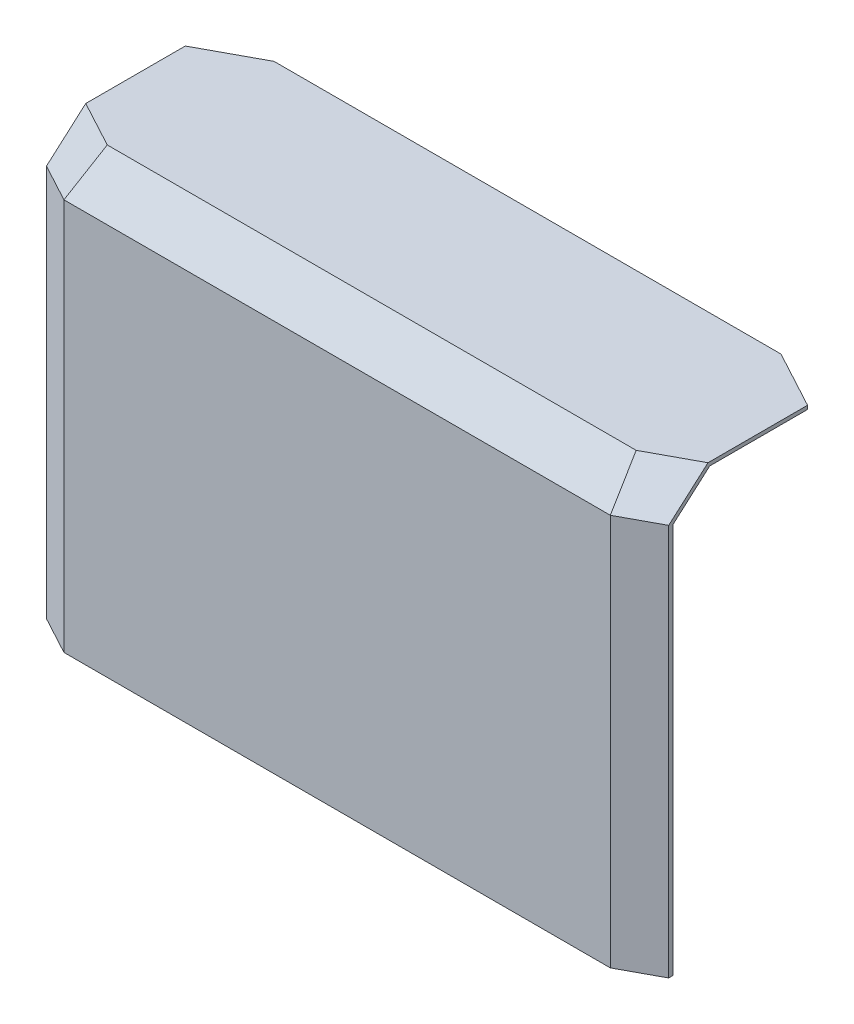
ISO-10303-21;
HEADER;
FILE_DESCRIPTION(('STEP AP214'),'2;1');
FILE_NAME('part.step','',(''),(''),'','','');
FILE_SCHEMA(('AUTOMOTIVE_DESIGN { 1 0 10303 214 1 1 1 1 }'));
ENDSEC;
DATA;
#1=APPLICATION_CONTEXT('core data for automotive mechanical design processes');
#2=APPLICATION_PROTOCOL_DEFINITION('international standard','automotive_design',2000,#1);
#3=PRODUCT_CONTEXT('',#1,'mechanical');
#4=PRODUCT('Part','Part','',(#3));
#5=PRODUCT_RELATED_PRODUCT_CATEGORY('part','',(#4));
#6=PRODUCT_DEFINITION_FORMATION('','',#4);
#7=PRODUCT_DEFINITION_CONTEXT('part definition',#1,'design');
#8=PRODUCT_DEFINITION('design','',#6,#7);
#9=PRODUCT_DEFINITION_SHAPE('','',#8);
#10=(LENGTH_UNIT() NAMED_UNIT(*) SI_UNIT(.MILLI.,.METRE.));
#11=(NAMED_UNIT(*) PLANE_ANGLE_UNIT() SI_UNIT($,.RADIAN.));
#12=(NAMED_UNIT(*) SI_UNIT($,.STERADIAN.) SOLID_ANGLE_UNIT());
#13=UNCERTAINTY_MEASURE_WITH_UNIT(LENGTH_MEASURE(1.E-05),#10,'distance_accuracy_value','');
#14=(GEOMETRIC_REPRESENTATION_CONTEXT(3) GLOBAL_UNCERTAINTY_ASSIGNED_CONTEXT((#13)) GLOBAL_UNIT_ASSIGNED_CONTEXT((#10,
#11,#12)) REPRESENTATION_CONTEXT('',''));
#15=CARTESIAN_POINT('',(0.,0.,0.));
#16=DIRECTION('',(0.,0.,1.));
#17=DIRECTION('',(1.,0.,0.));
#18=AXIS2_PLACEMENT_3D('',#15,#16,#17);
#19=CARTESIAN_POINT('',(354.056220457634,49.99,163.381713280479));
#20=DIRECTION('',(-1.,0.,0.));
#21=DIRECTION('',(0.,0.,1.));
#22=AXIS2_PLACEMENT_3D('',#19,#20,#21);
#23=PLANE('',#22);
#24=DIRECTION('',(0.,-0.660751107356154,0.750605072010319));
#25=VECTOR('',#24,1.);
#26=CARTESIAN_POINT('',(354.056220457634,374.541367845536,301.368842451599));
#27=LINE('',#26,#25);
#28=CARTESIAN_POINT('',(354.056220457634,420.,249.728399504298));
#29=VERTEX_POINT('',#28);
#30=CARTESIAN_POINT('',(354.056220457634,390.,283.808027838802));
#31=VERTEX_POINT('',#30);
#32=EDGE_CURVE('E266',#29,#31,#27,.T.);
#33=ORIENTED_EDGE('',*,*,#32,.T.);
#34=DIRECTION('',(0.,1.,0.));
#35=VECTOR('',#34,1.);
#36=CARTESIAN_POINT('',(354.056220457634,1040.95052293774,283.808027838802));
#37=LINE('',#36,#35);
#38=CARTESIAN_POINT('',(354.056220457634,50.,283.808027838802));
#39=VERTEX_POINT('',#38);
#40=EDGE_CURVE('E270',#39,#31,#37,.T.);
#41=ORIENTED_EDGE('',*,*,#40,.F.);
#42=DIRECTION('',(0.,0.,1.));
#43=VECTOR('',#42,1.);
#44=CARTESIAN_POINT('',(354.056220457634,50.,20.9300000000832));
#45=LINE('',#44,#43);
#46=CARTESIAN_POINT('',(354.056220457634,50.,280.195587235344));
#47=VERTEX_POINT('',#46);
#48=EDGE_CURVE('E268',#47,#39,#45,.T.);
#49=ORIENTED_EDGE('',*,*,#48,.F.);
#50=DIRECTION('',(0.,1.,0.));
#51=VECTOR('',#50,1.);
#52=CARTESIAN_POINT('',(354.056220457634,1040.95052293774,280.195587235344));
#53=LINE('',#52,#51);
#54=CARTESIAN_POINT('',(354.056220457634,388.682800871653,280.195587235344));
#55=VERTEX_POINT('',#54);
#56=EDGE_CURVE('E58',#47,#55,#53,.T.);
#57=ORIENTED_EDGE('',*,*,#56,.T.);
#58=DIRECTION('',(0.,-0.660751107356154,0.750605072010319));
#59=VECTOR('',#58,1.);
#60=CARTESIAN_POINT('',(354.056220457634,372.007609995386,299.138397484348));
#61=LINE('',#60,#59);
#62=CARTESIAN_POINT('',(354.056220457634,416.82,248.232077613078));
#63=VERTEX_POINT('',#62);
#64=EDGE_CURVE('E218',#63,#55,#61,.T.);
#65=ORIENTED_EDGE('',*,*,#64,.F.);
#66=DIRECTION('',(0.,0.,1.));
#67=VECTOR('',#66,1.);
#68=CARTESIAN_POINT('',(354.056220457634,416.82,0.));
#69=LINE('',#68,#67);
#70=CARTESIAN_POINT('',(354.056220457634,416.82,163.381713280479));
#71=VERTEX_POINT('',#70);
#72=EDGE_CURVE('E172',#71,#63,#69,.T.);
#73=ORIENTED_EDGE('',*,*,#72,.F.);
#74=DIRECTION('',(0.,1.,0.));
#75=VECTOR('',#74,1.);
#76=CARTESIAN_POINT('',(354.056220457634,49.99,163.381713280479));
#77=LINE('',#76,#75);
#78=CARTESIAN_POINT('',(354.056220457634,420.,163.381713280479));
#79=VERTEX_POINT('',#78);
#80=EDGE_CURVE('E11',#71,#79,#77,.T.);
#81=ORIENTED_EDGE('',*,*,#80,.T.);
#82=DIRECTION('',(0.,0.,1.));
#83=VECTOR('',#82,1.);
#84=CARTESIAN_POINT('',(354.056220457634,420.,0.));
#85=LINE('',#84,#83);
#86=EDGE_CURVE('E243',#79,#29,#85,.T.);
#87=ORIENTED_EDGE('',*,*,#86,.T.);
#88=EDGE_LOOP('',(#33,#41,#49,#57,#65,#73,#81,#87));
#89=FACE_BOUND('',#88,.T.);
#90=ADVANCED_FACE('F33',(#89),#23,.F.);
#91=CARTESIAN_POINT('',(-185.65,49.99,313.732193207324));
#92=DIRECTION('',(1.,0.,0.));
#93=DIRECTION('',(0.,0.,-1.));
#94=AXIS2_PLACEMENT_3D('',#91,#92,#93);
#95=PLANE('',#94);
#96=DIRECTION('',(0.,0.660751107356154,-0.750605072010319));
#97=VECTOR('',#96,1.);
#98=CARTESIAN_POINT('',(-185.65,409.424009809615,261.742593336221));
#99=LINE('',#98,#97);
#100=CARTESIAN_POINT('',(-185.65,390.,283.808027838802));
#101=VERTEX_POINT('',#100);
#102=CARTESIAN_POINT('',(-185.65,420.,249.728399504298));
#103=VERTEX_POINT('',#102);
#104=EDGE_CURVE('E37',#101,#103,#99,.T.);
#105=ORIENTED_EDGE('',*,*,#104,.T.);
#106=DIRECTION('',(0.,0.,-1.));
#107=VECTOR('',#106,1.);
#108=CARTESIAN_POINT('',(-185.65,420.,0.));
#109=LINE('',#108,#107);
#110=CARTESIAN_POINT('',(-185.65,420.,163.381713280479));
#111=VERTEX_POINT('',#110);
#112=EDGE_CURVE('E254',#103,#111,#109,.T.);
#113=ORIENTED_EDGE('',*,*,#112,.T.);
#114=DIRECTION('',(0.,1.,0.));
#115=VECTOR('',#114,1.);
#116=CARTESIAN_POINT('',(-185.65,49.99,163.381713280479));
#117=LINE('',#116,#115);
#118=CARTESIAN_POINT('',(-185.65,416.82,163.381713280479));
#119=VERTEX_POINT('',#118);
#120=EDGE_CURVE('E261',#119,#111,#117,.T.);
#121=ORIENTED_EDGE('',*,*,#120,.F.);
#122=DIRECTION('',(0.,0.,-1.));
#123=VECTOR('',#122,1.);
#124=CARTESIAN_POINT('',(-185.65,416.82,0.));
#125=LINE('',#124,#123);
#126=CARTESIAN_POINT('',(-185.65,416.82,248.232077613078));
#127=VERTEX_POINT('',#126);
#128=EDGE_CURVE('E242',#127,#119,#125,.T.);
#129=ORIENTED_EDGE('',*,*,#128,.F.);
#130=DIRECTION('',(0.,0.660751107356154,-0.750605072010319));
#131=VECTOR('',#130,1.);
#132=CARTESIAN_POINT('',(-185.65,406.890251959465,259.512148368969));
#133=LINE('',#132,#131);
#134=CARTESIAN_POINT('',(-185.65,388.682800871653,280.195587235344));
#135=VERTEX_POINT('',#134);
#136=EDGE_CURVE('E232',#135,#127,#133,.T.);
#137=ORIENTED_EDGE('',*,*,#136,.F.);
#138=DIRECTION('',(0.,-1.,0.));
#139=VECTOR('',#138,1.);
#140=CARTESIAN_POINT('',(-185.65,1040.95052293774,280.195587235344));
#141=LINE('',#140,#139);
#142=CARTESIAN_POINT('',(-185.65,50.,280.195587235344));
#143=VERTEX_POINT('',#142);
#144=EDGE_CURVE('E264',#135,#143,#141,.T.);
#145=ORIENTED_EDGE('',*,*,#144,.T.);
#146=DIRECTION('',(0.,0.,-1.));
#147=VECTOR('',#146,1.);
#148=CARTESIAN_POINT('',(-185.65,50.,20.9300000000832));
#149=LINE('',#148,#147);
#150=CARTESIAN_POINT('',(-185.65,50.,283.808027838802));
#151=VERTEX_POINT('',#150);
#152=EDGE_CURVE('E50',#151,#143,#149,.T.);
#153=ORIENTED_EDGE('',*,*,#152,.F.);
#154=DIRECTION('',(0.,-1.,0.));
#155=VECTOR('',#154,1.);
#156=CARTESIAN_POINT('',(-185.65,1040.95052293774,283.808027838802));
#157=LINE('',#156,#155);
#158=EDGE_CURVE('E272',#101,#151,#157,.T.);
#159=ORIENTED_EDGE('',*,*,#158,.F.);
#160=EDGE_LOOP('',(#105,#113,#121,#129,#137,#145,#153,#159));
#161=FACE_BOUND('',#160,.T.);
#162=ADVANCED_FACE('F35',(#161),#95,.F.);
#163=CARTESIAN_POINT('',(304.056220457634,49.99,136.434178481977));
#164=DIRECTION('',(-0.474433603571065,0.,0.880291290313936));
#165=DIRECTION('',(0.880291290313936,0.,0.474433603571065));
#166=AXIS2_PLACEMENT_3D('',#163,#164,#165);
#167=PLANE('',#166);
#168=DIRECTION('',(0.,1.,0.));
#169=VECTOR('',#168,1.);
#170=CARTESIAN_POINT('',(304.056220457634,49.99,136.434178481977));
#171=LINE('',#170,#169);
#172=CARTESIAN_POINT('',(304.056220457634,416.82,136.434178481977));
#173=VERTEX_POINT('',#172);
#174=CARTESIAN_POINT('',(304.056220457634,420.,136.434178481977));
#175=VERTEX_POINT('',#174);
#176=EDGE_CURVE('E42',#173,#175,#171,.T.);
#177=ORIENTED_EDGE('',*,*,#176,.T.);
#178=DIRECTION('',(0.880291290313936,0.,0.474433603571065));
#179=VECTOR('',#178,1.);
#180=CARTESIAN_POINT('',(11.4588379513546,420.,-21.2613844587955));
#181=LINE('',#180,#179);
#182=EDGE_CURVE('E245',#175,#79,#181,.T.);
#183=ORIENTED_EDGE('',*,*,#182,.T.);
#184=ORIENTED_EDGE('',*,*,#80,.F.);
#185=DIRECTION('',(0.880291290313936,0.,0.474433603571065));
#186=VECTOR('',#185,1.);
#187=CARTESIAN_POINT('',(11.4588379513546,416.82,-21.2613844587955));
#188=LINE('',#187,#186);
#189=EDGE_CURVE('E234',#173,#71,#188,.T.);
#190=ORIENTED_EDGE('',*,*,#189,.F.);
#191=EDGE_LOOP('',(#177,#183,#184,#190));
#192=FACE_BOUND('',#191,.T.);
#193=ADVANCED_FACE('F345',(#192),#167,.F.);
#194=CARTESIAN_POINT('',(-135.65,49.99,136.434178481977));
#195=DIRECTION('',(0.,0.,1.));
#196=DIRECTION('',(1.,0.,0.));
#197=AXIS2_PLACEMENT_3D('',#194,#195,#196);
#198=PLANE('',#197);
#199=DIRECTION('',(0.,1.,0.));
#200=VECTOR('',#199,1.);
#201=CARTESIAN_POINT('',(-135.65,49.99,136.434178481977));
#202=LINE('',#201,#200);
#203=CARTESIAN_POINT('',(-135.65,416.82,136.434178481977));
#204=VERTEX_POINT('',#203);
#205=CARTESIAN_POINT('',(-135.65,420.,136.434178481977));
#206=VERTEX_POINT('',#205);
#207=EDGE_CURVE('E258',#204,#206,#202,.T.);
#208=ORIENTED_EDGE('',*,*,#207,.T.);
#209=DIRECTION('',(1.,0.,0.));
#210=VECTOR('',#209,1.);
#211=CARTESIAN_POINT('',(0.,420.,136.434178481977));
#212=LINE('',#211,#210);
#213=EDGE_CURVE('E248',#206,#175,#212,.T.);
#214=ORIENTED_EDGE('',*,*,#213,.T.);
#215=ORIENTED_EDGE('',*,*,#176,.F.);
#216=DIRECTION('',(1.,0.,0.));
#217=VECTOR('',#216,1.);
#218=CARTESIAN_POINT('',(0.,416.82,136.434178481977));
#219=LINE('',#218,#217);
#220=EDGE_CURVE('E236',#204,#173,#219,.T.);
#221=ORIENTED_EDGE('',*,*,#220,.F.);
#222=EDGE_LOOP('',(#208,#214,#215,#221));
#223=FACE_BOUND('',#222,.T.);
#224=ADVANCED_FACE('F351',(#223),#198,.F.);
#225=CARTESIAN_POINT('',(-185.65,49.99,163.381713280479));
#226=DIRECTION('',(0.474433603571064,0.,0.880291290313936));
#227=DIRECTION('',(0.880291290313936,0.,-0.474433603571064));
#228=AXIS2_PLACEMENT_3D('',#225,#226,#227);
#229=PLANE('',#228);
#230=ORIENTED_EDGE('',*,*,#120,.T.);
#231=DIRECTION('',(0.880291290313936,0.,-0.474433603571064));
#232=VECTOR('',#231,1.);
#233=CARTESIAN_POINT('',(26.4472541171585,420.,49.0717505607015));
#234=LINE('',#233,#232);
#235=EDGE_CURVE('E251',#111,#206,#234,.T.);
#236=ORIENTED_EDGE('',*,*,#235,.T.);
#237=ORIENTED_EDGE('',*,*,#207,.F.);
#238=DIRECTION('',(0.880291290313936,0.,-0.474433603571064));
#239=VECTOR('',#238,1.);
#240=CARTESIAN_POINT('',(26.4472541171585,416.82,49.0717505607015));
#241=LINE('',#240,#239);
#242=EDGE_CURVE('E239',#119,#204,#241,.T.);
#243=ORIENTED_EDGE('',*,*,#242,.F.);
#244=EDGE_LOOP('',(#230,#236,#237,#243));
#245=FACE_BOUND('',#244,.T.);
#246=ADVANCED_FACE('F309',(#245),#229,.F.);
#247=CARTESIAN_POINT('',(-152.747945688264,1040.95052293774,301.540612908956));
#248=DIRECTION('',(0.,0.,-1.));
#249=DIRECTION('',(-1.,0.,0.));
#250=AXIS2_PLACEMENT_3D('',#247,#248,#249);
#251=PLANE('',#250);
#252=DIRECTION('',(0.,-1.,0.));
#253=VECTOR('',#252,1.);
#254=CARTESIAN_POINT('',(-152.747945688264,1040.95052293774,301.540612908956));
#255=LINE('',#254,#253);
#256=CARTESIAN_POINT('',(-152.747945688264,390.,301.540612908956));
#257=VERTEX_POINT('',#256);
#258=CARTESIAN_POINT('',(-152.747945688264,50.,301.540612908956));
#259=VERTEX_POINT('',#258);
#260=EDGE_CURVE('E190',#257,#259,#255,.T.);
#261=ORIENTED_EDGE('',*,*,#260,.T.);
#262=DIRECTION('',(1.,0.,0.));
#263=VECTOR('',#262,1.);
#264=CARTESIAN_POINT('',(-152.747945688264,50.,301.540612908956));
#265=LINE('',#264,#263);
#266=CARTESIAN_POINT('',(321.154166145898,50.,301.540612908956));
#267=VERTEX_POINT('',#266);
#268=EDGE_CURVE('E227',#259,#267,#265,.T.);
#269=ORIENTED_EDGE('',*,*,#268,.T.);
#270=DIRECTION('',(0.,-1.,0.));
#271=VECTOR('',#270,1.);
#272=CARTESIAN_POINT('',(321.154166145898,1040.95052293774,301.540612908956));
#273=LINE('',#272,#271);
#274=CARTESIAN_POINT('',(321.154166145898,390.,301.540612908956));
#275=VERTEX_POINT('',#274);
#276=EDGE_CURVE('E194',#275,#267,#273,.T.);
#277=ORIENTED_EDGE('',*,*,#276,.F.);
#278=DIRECTION('',(-1.,0.,0.));
#279=VECTOR('',#278,1.);
#280=CARTESIAN_POINT('',(-152.747945688264,390.,301.540612908956));
#281=LINE('',#280,#279);
#282=EDGE_CURVE('E209',#275,#257,#281,.T.);
#283=ORIENTED_EDGE('',*,*,#282,.T.);
#284=EDGE_LOOP('',(#261,#269,#277,#283));
#285=FACE_BOUND('',#284,.T.);
#286=ADVANCED_FACE('F291',(#285),#251,.F.);
#287=CARTESIAN_POINT('',(394.066220457634,50.,20.9300000000832));
#288=DIRECTION('',(0.,1.,0.));
#289=DIRECTION('',(0.,0.,1.));
#290=AXIS2_PLACEMENT_3D('',#287,#288,#289);
#291=PLANE('',#290);
#292=DIRECTION('',(0.880291290313936,0.,0.474433603571064));
#293=VECTOR('',#292,1.);
#294=CARTESIAN_POINT('',(-225.65,50.,262.25));
#295=LINE('',#294,#293);
#296=EDGE_CURVE('E211',#151,#259,#295,.T.);
#297=ORIENTED_EDGE('',*,*,#296,.F.);
#298=ORIENTED_EDGE('',*,*,#152,.T.);
#299=DIRECTION('',(0.880291290313936,0.,0.474433603571064));
#300=VECTOR('',#299,1.);
#301=CARTESIAN_POINT('',(-224.141301140644,50.,259.450673696802));
#302=LINE('',#301,#300);
#303=CARTESIAN_POINT('',(-151.945570616313,50.,298.360612908956));
#304=VERTEX_POINT('',#303);
#305=EDGE_CURVE('E216',#143,#304,#302,.T.);
#306=ORIENTED_EDGE('',*,*,#305,.T.);
#307=DIRECTION('',(1.,0.,0.));
#308=VECTOR('',#307,1.);
#309=CARTESIAN_POINT('',(-152.747945688264,50.,298.360612908956));
#310=LINE('',#309,#308);
#311=CARTESIAN_POINT('',(320.351791073946,50.,298.360612908956));
#312=VERTEX_POINT('',#311);
#313=EDGE_CURVE('E219',#304,#312,#310,.T.);
#314=ORIENTED_EDGE('',*,*,#313,.T.);
#315=DIRECTION('',(0.880291290313937,0.,-0.474433603571063));
#316=VECTOR('',#315,1.);
#317=CARTESIAN_POINT('',(319.645467286542,50.,298.741286605758));
#318=LINE('',#317,#316);
#319=EDGE_CURVE('E222',#312,#47,#318,.T.);
#320=ORIENTED_EDGE('',*,*,#319,.T.);
#321=ORIENTED_EDGE('',*,*,#48,.T.);
#322=DIRECTION('',(0.880291290313937,0.,-0.474433603571063));
#323=VECTOR('',#322,1.);
#324=CARTESIAN_POINT('',(321.154166145898,50.,301.540612908956));
#325=LINE('',#324,#323);
#326=EDGE_CURVE('E225',#267,#39,#325,.T.);
#327=ORIENTED_EDGE('',*,*,#326,.F.);
#328=ORIENTED_EDGE('',*,*,#268,.F.);
#329=EDGE_LOOP('',(#297,#298,#306,#314,#320,#321,#327,#328));
#330=FACE_BOUND('',#329,.T.);
#331=ADVANCED_FACE('F287',(#330),#291,.F.);
#332=CARTESIAN_POINT('',(-152.747945688264,1040.95052293774,298.360612908956));
#333=DIRECTION('',(0.,0.,-1.));
#334=DIRECTION('',(-1.,0.,0.));
#335=AXIS2_PLACEMENT_3D('',#332,#333,#334);
#336=PLANE('',#335);
#337=ORIENTED_EDGE('',*,*,#313,.F.);
#338=DIRECTION('',(0.,-1.,0.));
#339=VECTOR('',#338,1.);
#340=CARTESIAN_POINT('',(-151.945570616313,1040.95052293774,298.360612908956));
#341=LINE('',#340,#339);
#342=CARTESIAN_POINT('',(-151.945570616313,388.682800871653,298.360612908956));
#343=VERTEX_POINT('',#342);
#344=EDGE_CURVE('E161',#343,#304,#341,.T.);
#345=ORIENTED_EDGE('',*,*,#344,.F.);
#346=DIRECTION('',(-1.,0.,0.));
#347=VECTOR('',#346,1.);
#348=CARTESIAN_POINT('',(0.,388.682800871653,298.360612908956));
#349=LINE('',#348,#347);
#350=CARTESIAN_POINT('',(320.351791073946,388.682800871653,298.360612908956));
#351=VERTEX_POINT('',#350);
#352=EDGE_CURVE('E181',#351,#343,#349,.T.);
#353=ORIENTED_EDGE('',*,*,#352,.F.);
#354=DIRECTION('',(0.,-1.,0.));
#355=VECTOR('',#354,1.);
#356=CARTESIAN_POINT('',(320.351791073946,1040.95052293774,298.360612908956));
#357=LINE('',#356,#355);
#358=EDGE_CURVE('E183',#351,#312,#357,.T.);
#359=ORIENTED_EDGE('',*,*,#358,.T.);
#360=EDGE_LOOP('',(#337,#345,#353,#359));
#361=FACE_BOUND('',#360,.T.);
#362=ADVANCED_FACE('F320',(#361),#336,.T.);
#363=CARTESIAN_POINT('',(0.,417.751400435827,269.292013344783));
#364=DIRECTION('',(0.,0.707106781186544,0.707106781186551));
#365=DIRECTION('',(-1.,0.,0.));
#366=AXIS2_PLACEMENT_3D('',#363,#364,#365);
#367=PLANE('',#366);
#368=DIRECTION('',(-0.17564294502407,-0.696114055260803,0.696114055260796));
#369=VECTOR('',#368,1.);
#370=CARTESIAN_POINT('',(-140.149690961804,435.432629739207,251.610784041402));
#371=LINE('',#370,#369);
#372=CARTESIAN_POINT('',(-144.846014900863,416.82,270.223413780609));
#373=VERTEX_POINT('',#372);
#374=EDGE_CURVE('E156',#373,#343,#371,.T.);
#375=ORIENTED_EDGE('',*,*,#374,.F.);
#376=DIRECTION('',(1.,0.,0.));
#377=VECTOR('',#376,1.);
#378=CARTESIAN_POINT('',(0.,416.82,270.223413780609));
#379=LINE('',#378,#377);
#380=CARTESIAN_POINT('',(313.252235358497,416.82,270.223413780609));
#381=VERTEX_POINT('',#380);
#382=EDGE_CURVE('E151',#373,#381,#379,.T.);
#383=ORIENTED_EDGE('',*,*,#382,.T.);
#384=DIRECTION('',(0.17564294502407,-0.696114055260803,0.696114055260796));
#385=VECTOR('',#384,1.);
#386=CARTESIAN_POINT('',(317.576462862166,399.682075427869,287.36133835274));
#387=LINE('',#386,#385);
#388=EDGE_CURVE('E154',#381,#351,#387,.T.);
#389=ORIENTED_EDGE('',*,*,#388,.T.);
#390=ORIENTED_EDGE('',*,*,#352,.T.);
#391=EDGE_LOOP('',(#375,#383,#389,#390));
#392=FACE_BOUND('',#391,.T.);
#393=ADVANCED_FACE('F153',(#392),#367,.F.);
#394=CARTESIAN_POINT('',(319.645467286542,1040.95052293774,298.741286605758));
#395=DIRECTION('',(-0.474433603571063,0.,-0.880291290313936));
#396=DIRECTION('',(-0.880291290313937,0.,0.474433603571063));
#397=AXIS2_PLACEMENT_3D('',#394,#395,#396);
#398=PLANE('',#397);
#399=ORIENTED_EDGE('',*,*,#56,.F.);
#400=ORIENTED_EDGE('',*,*,#319,.F.);
#401=ORIENTED_EDGE('',*,*,#358,.F.);
#402=DIRECTION('',(-0.880291290313936,0.,0.474433603571063));
#403=VECTOR('',#402,1.);
#404=CARTESIAN_POINT('',(196.714359297205,388.682800871653,364.995092812979));
#405=LINE('',#404,#403);
#406=EDGE_CURVE('E167',#55,#351,#405,.T.);
#407=ORIENTED_EDGE('',*,*,#406,.F.);
#408=EDGE_LOOP('',(#399,#400,#401,#407));
#409=FACE_BOUND('',#408,.T.);
#410=ADVANCED_FACE('F322',(#409),#398,.T.);
#411=CARTESIAN_POINT('',(0.,416.82,0.));
#412=DIRECTION('',(0.,1.,0.));
#413=DIRECTION('',(0.,0.,1.));
#414=AXIS2_PLACEMENT_3D('',#411,#412,#413);
#415=PLANE('',#414);
#416=DIRECTION('',(0.880291290313936,0.,0.474433603571064));
#417=VECTOR('',#416,1.);
#418=CARTESIAN_POINT('',(-145.459034451835,416.82,269.89302646697));
#419=LINE('',#418,#417);
#420=EDGE_CURVE('E160',#127,#373,#419,.T.);
#421=ORIENTED_EDGE('',*,*,#420,.F.);
#422=ORIENTED_EDGE('',*,*,#128,.T.);
#423=ORIENTED_EDGE('',*,*,#242,.T.);
#424=ORIENTED_EDGE('',*,*,#220,.T.);
#425=ORIENTED_EDGE('',*,*,#189,.T.);
#426=ORIENTED_EDGE('',*,*,#72,.T.);
#427=DIRECTION('',(0.880291290313936,0.,-0.474433603571063));
#428=VECTOR('',#427,1.);
#429=CARTESIAN_POINT('',(183.365126520347,416.82,340.226161486467));
#430=LINE('',#429,#428);
#431=EDGE_CURVE('E166',#381,#63,#430,.T.);
#432=ORIENTED_EDGE('',*,*,#431,.F.);
#433=ORIENTED_EDGE('',*,*,#382,.F.);
#434=EDGE_LOOP('',(#421,#422,#423,#424,#425,#426,#432,#433));
#435=FACE_BOUND('',#434,.T.);
#436=ADVANCED_FACE('F170',(#435),#415,.F.);
#437=CARTESIAN_POINT('',(182.92323885521,417.751400435827,339.406257795014));
#438=DIRECTION('',(0.33547521830787,0.707106781186544,0.622459940800443));
#439=DIRECTION('',(-0.880291290313937,0.,0.474433603571063));
#440=AXIS2_PLACEMENT_3D('',#437,#438,#439);
#441=PLANE('',#440);
#442=ORIENTED_EDGE('',*,*,#431,.T.);
#443=ORIENTED_EDGE('',*,*,#64,.T.);
#444=ORIENTED_EDGE('',*,*,#406,.T.);
#445=ORIENTED_EDGE('',*,*,#388,.F.);
#446=EDGE_LOOP('',(#442,#443,#444,#445));
#447=FACE_BOUND('',#446,.T.);
#448=ADVANCED_FACE('F165',(#447),#441,.F.);
#449=CARTESIAN_POINT('',(-224.141301140644,1040.95052293774,259.450673696802));
#450=DIRECTION('',(0.474433603571064,0.,-0.880291290313936));
#451=DIRECTION('',(-0.880291290313936,0.,-0.474433603571064));
#452=AXIS2_PLACEMENT_3D('',#449,#450,#451);
#453=PLANE('',#452);
#454=ORIENTED_EDGE('',*,*,#144,.F.);
#455=DIRECTION('',(-0.880291290313936,0.,-0.474433603571064));
#456=VECTOR('',#455,1.);
#457=CARTESIAN_POINT('',(-158.808267228693,388.682800871653,294.661957793482));
#458=LINE('',#457,#456);
#459=EDGE_CURVE('E175',#343,#135,#458,.T.);
#460=ORIENTED_EDGE('',*,*,#459,.F.);
#461=ORIENTED_EDGE('',*,*,#344,.T.);
#462=ORIENTED_EDGE('',*,*,#305,.F.);
#463=EDGE_LOOP('',(#454,#460,#461,#462));
#464=FACE_BOUND('',#463,.T.);
#465=ADVANCED_FACE('F316',(#464),#453,.T.);
#466=CARTESIAN_POINT('',(-145.017146786698,417.751400435827,269.073122775517));
#467=DIRECTION('',(-0.335475218307871,0.707106781186544,0.622459940800443));
#468=DIRECTION('',(-0.880291290313936,0.,-0.474433603571064));
#469=AXIS2_PLACEMENT_3D('',#466,#467,#468);
#470=PLANE('',#469);
#471=ORIENTED_EDGE('',*,*,#459,.T.);
#472=ORIENTED_EDGE('',*,*,#136,.T.);
#473=ORIENTED_EDGE('',*,*,#420,.T.);
#474=ORIENTED_EDGE('',*,*,#374,.T.);
#475=EDGE_LOOP('',(#471,#472,#473,#474));
#476=FACE_BOUND('',#475,.T.);
#477=ADVANCED_FACE('F313',(#476),#470,.F.);
#478=CARTESIAN_POINT('',(321.154166145898,1040.95052293774,301.540612908956));
#479=DIRECTION('',(-0.474433603571063,0.,-0.880291290313936));
#480=DIRECTION('',(-0.880291290313937,0.,0.474433603571063));
#481=AXIS2_PLACEMENT_3D('',#478,#479,#480);
#482=PLANE('',#481);
#483=ORIENTED_EDGE('',*,*,#326,.T.);
#484=ORIENTED_EDGE('',*,*,#40,.T.);
#485=DIRECTION('',(-0.880291290313937,0.,0.474433603571063));
#486=VECTOR('',#485,1.);
#487=CARTESIAN_POINT('',(321.154166145898,390.,301.540612908956));
#488=LINE('',#487,#486);
#489=EDGE_CURVE('E204',#31,#275,#488,.T.);
#490=ORIENTED_EDGE('',*,*,#489,.T.);
#491=ORIENTED_EDGE('',*,*,#276,.T.);
#492=EDGE_LOOP('',(#483,#484,#490,#491));
#493=FACE_BOUND('',#492,.T.);
#494=ADVANCED_FACE('F328',(#493),#482,.F.);
#495=CARTESIAN_POINT('',(0.,420.,271.540612908956));
#496=DIRECTION('',(0.,0.707106781186544,0.707106781186551));
#497=DIRECTION('',(-1.,0.,0.));
#498=AXIS2_PLACEMENT_3D('',#495,#496,#497);
#499=PLANE('',#498);
#500=DIRECTION('',(-0.17564294502407,-0.696114055260803,0.696114055260796));
#501=VECTOR('',#500,1.);
#502=CARTESIAN_POINT('',(-140.699552358489,437.750599598621,253.790013310335));
#503=LINE('',#502,#501);
#504=CARTESIAN_POINT('',(-145.178369537776,420.,271.540612908956));
#505=VERTEX_POINT('',#504);
#506=EDGE_CURVE('E197',#505,#257,#503,.T.);
#507=ORIENTED_EDGE('',*,*,#506,.T.);
#508=ORIENTED_EDGE('',*,*,#282,.F.);
#509=DIRECTION('',(-0.17564294502407,0.696114055260803,-0.696114055260796));
#510=VECTOR('',#509,1.);
#511=CARTESIAN_POINT('',(303.910366119617,458.341210987756,233.199401921201));
#512=LINE('',#511,#510);
#513=CARTESIAN_POINT('',(313.584589995409,420.,271.540612908956));
#514=VERTEX_POINT('',#513);
#515=EDGE_CURVE('E187',#514,#275,#512,.F.);
#516=ORIENTED_EDGE('',*,*,#515,.F.);
#517=DIRECTION('',(1.,0.,0.));
#518=VECTOR('',#517,1.);
#519=CARTESIAN_POINT('',(321.154166145898,420.,271.540612908956));
#520=LINE('',#519,#518);
#521=EDGE_CURVE('E193',#505,#514,#520,.T.);
#522=ORIENTED_EDGE('',*,*,#521,.F.);
#523=EDGE_LOOP('',(#507,#508,#516,#522));
#524=FACE_BOUND('',#523,.T.);
#525=ADVANCED_FACE('F299',(#524),#499,.T.);
#526=CARTESIAN_POINT('',(0.,420.,0.));
#527=DIRECTION('',(0.,1.,0.));
#528=DIRECTION('',(0.,0.,1.));
#529=AXIS2_PLACEMENT_3D('',#526,#527,#528);
#530=PLANE('',#529);
#531=ORIENTED_EDGE('',*,*,#112,.F.);
#532=DIRECTION('',(0.880291290313936,0.,0.474433603571064));
#533=VECTOR('',#532,1.);
#534=CARTESIAN_POINT('',(-138.514937581133,420.,275.131874199538));
#535=LINE('',#534,#533);
#536=EDGE_CURVE('E199',#103,#505,#535,.T.);
#537=ORIENTED_EDGE('',*,*,#536,.T.);
#538=ORIENTED_EDGE('',*,*,#521,.T.);
#539=DIRECTION('',(0.880291290313937,0.,-0.474433603571063));
#540=VECTOR('',#539,1.);
#541=CARTESIAN_POINT('',(379.823212350502,420.,235.841261290582));
#542=LINE('',#541,#540);
#543=EDGE_CURVE('E201',#514,#29,#542,.T.);
#544=ORIENTED_EDGE('',*,*,#543,.T.);
#545=ORIENTED_EDGE('',*,*,#86,.F.);
#546=ORIENTED_EDGE('',*,*,#182,.F.);
#547=ORIENTED_EDGE('',*,*,#213,.F.);
#548=ORIENTED_EDGE('',*,*,#235,.F.);
#549=EDGE_LOOP('',(#531,#537,#538,#544,#545,#546,#547,#548));
#550=FACE_BOUND('',#549,.T.);
#551=ADVANCED_FACE('F303',(#550),#530,.T.);
#552=CARTESIAN_POINT('',(183.990050049429,420.,341.385680406759));
#553=DIRECTION('',(0.33547521830787,0.707106781186544,0.622459940800443));
#554=DIRECTION('',(-0.880291290313937,0.,0.474433603571063));
#555=AXIS2_PLACEMENT_3D('',#552,#553,#554);
#556=PLANE('',#555);
#557=ORIENTED_EDGE('',*,*,#32,.F.);
#558=ORIENTED_EDGE('',*,*,#543,.F.);
#559=ORIENTED_EDGE('',*,*,#515,.T.);
#560=ORIENTED_EDGE('',*,*,#489,.F.);
#561=EDGE_LOOP('',(#557,#558,#559,#560));
#562=FACE_BOUND('',#561,.T.);
#563=ADVANCED_FACE('F330',(#562),#556,.T.);
#564=CARTESIAN_POINT('',(-225.65,1040.95052293774,262.25));
#565=DIRECTION('',(0.474433603571064,0.,-0.880291290313936));
#566=DIRECTION('',(-0.880291290313936,0.,-0.474433603571064));
#567=AXIS2_PLACEMENT_3D('',#564,#565,#566);
#568=PLANE('',#567);
#569=DIRECTION('',(-0.880291290313936,0.,-0.474433603571064));
#570=VECTOR('',#569,1.);
#571=CARTESIAN_POINT('',(-225.65,390.,262.25));
#572=LINE('',#571,#570);
#573=EDGE_CURVE('E206',#257,#101,#572,.T.);
#574=ORIENTED_EDGE('',*,*,#573,.T.);
#575=ORIENTED_EDGE('',*,*,#158,.T.);
#576=ORIENTED_EDGE('',*,*,#296,.T.);
#577=ORIENTED_EDGE('',*,*,#260,.F.);
#578=EDGE_LOOP('',(#574,#575,#576,#577));
#579=FACE_BOUND('',#578,.T.);
#580=ADVANCED_FACE('F278',(#579),#568,.F.);
#581=CARTESIAN_POINT('',(-146.083957980917,420.,271.052545387263));
#582=DIRECTION('',(-0.335475218307871,0.707106781186544,0.622459940800443));
#583=DIRECTION('',(-0.880291290313936,0.,-0.474433603571064));
#584=AXIS2_PLACEMENT_3D('',#581,#582,#583);
#585=PLANE('',#584);
#586=ORIENTED_EDGE('',*,*,#104,.F.);
#587=ORIENTED_EDGE('',*,*,#573,.F.);
#588=ORIENTED_EDGE('',*,*,#506,.F.);
#589=ORIENTED_EDGE('',*,*,#536,.F.);
#590=EDGE_LOOP('',(#586,#587,#588,#589));
#591=FACE_BOUND('',#590,.T.);
#592=ADVANCED_FACE('F295',(#591),#585,.T.);
#593=CLOSED_SHELL('',(#90,#162,#193,#224,#246,#286,#331,#362,#393,#410,#436,#448,#465,#477,#494,
#525,#551,#563,#580,#592));
#594=MANIFOLD_SOLID_BREP('B2',#593);
#595=ADVANCED_BREP_SHAPE_REPRESENTATION('',(#18,#594),#14);
#596=SHAPE_DEFINITION_REPRESENTATION(#9,#595);
ENDSEC;
END-ISO-10303-21;
